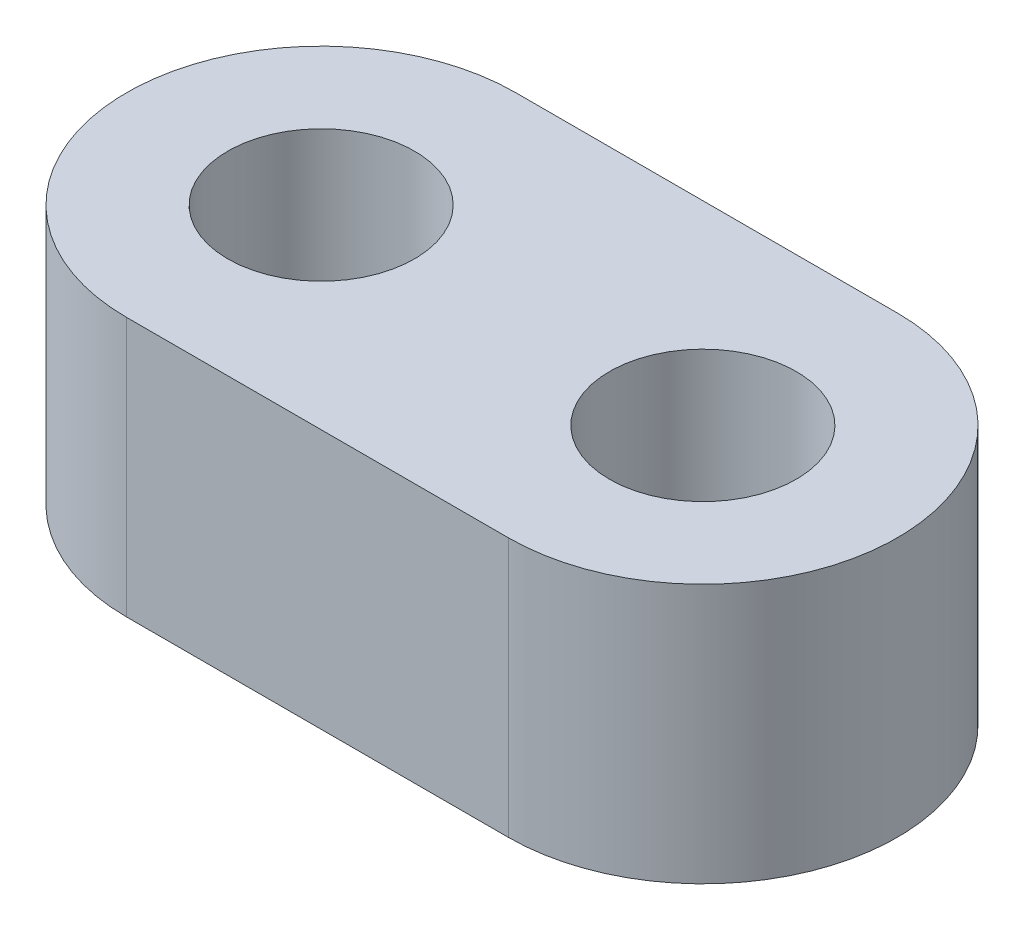
ISO-10303-21;
HEADER;
FILE_DESCRIPTION(('STEP AP214'),'2;1');
FILE_NAME('part.step','',(''),(''),'','','');
FILE_SCHEMA(('AUTOMOTIVE_DESIGN { 1 0 10303 214 1 1 1 1 }'));
ENDSEC;
DATA;
#1=APPLICATION_CONTEXT('core data for automotive mechanical design processes');
#2=APPLICATION_PROTOCOL_DEFINITION('international standard','automotive_design',2000,#1);
#3=PRODUCT_CONTEXT('',#1,'mechanical');
#4=PRODUCT('Part','Part','',(#3));
#5=PRODUCT_RELATED_PRODUCT_CATEGORY('part','',(#4));
#6=PRODUCT_DEFINITION_FORMATION('','',#4);
#7=PRODUCT_DEFINITION_CONTEXT('part definition',#1,'design');
#8=PRODUCT_DEFINITION('design','',#6,#7);
#9=PRODUCT_DEFINITION_SHAPE('','',#8);
#10=(LENGTH_UNIT() NAMED_UNIT(*) SI_UNIT(.MILLI.,.METRE.));
#11=(NAMED_UNIT(*) PLANE_ANGLE_UNIT() SI_UNIT($,.RADIAN.));
#12=(NAMED_UNIT(*) SI_UNIT($,.STERADIAN.) SOLID_ANGLE_UNIT());
#13=UNCERTAINTY_MEASURE_WITH_UNIT(LENGTH_MEASURE(1.E-05),#10,'distance_accuracy_value','');
#14=(GEOMETRIC_REPRESENTATION_CONTEXT(3) GLOBAL_UNCERTAINTY_ASSIGNED_CONTEXT((#13)) GLOBAL_UNIT_ASSIGNED_CONTEXT((#10,
#11,#12)) REPRESENTATION_CONTEXT('',''));
#15=CARTESIAN_POINT('',(0.,0.,0.));
#16=DIRECTION('',(0.,0.,1.));
#17=DIRECTION('',(1.,0.,0.));
#18=AXIS2_PLACEMENT_3D('',#15,#16,#17);
#19=CARTESIAN_POINT('',(0.,6.35,0.));
#20=DIRECTION('',(0.,1.,0.));
#21=DIRECTION('',(0.,0.,1.));
#22=AXIS2_PLACEMENT_3D('',#19,#20,#21);
#23=PLANE('',#22);
#24=CARTESIAN_POINT('',(9.34260638297873,6.35,0.));
#25=DIRECTION('',(0.,1.,0.));
#26=DIRECTION('',(0.,0.,1.));
#27=AXIS2_PLACEMENT_3D('',#24,#25,#26);
#28=CIRCLE('',#27,2.286);
#29=CARTESIAN_POINT('',(9.34260638297873,6.35,2.286));
#30=VERTEX_POINT('',#29);
#31=EDGE_CURVE('E174',#30,#30,#28,.T.);
#32=ORIENTED_EDGE('',*,*,#31,.F.);
#33=EDGE_LOOP('',(#32));
#34=FACE_BOUND('',#33,.T.);
#35=CARTESIAN_POINT('',(0.,6.35,0.));
#36=DIRECTION('',(0.,1.,0.));
#37=DIRECTION('',(0.,0.,1.));
#38=AXIS2_PLACEMENT_3D('',#35,#36,#37);
#39=CIRCLE('',#38,2.286);
#40=CARTESIAN_POINT('',(0.,6.35,2.286));
#41=VERTEX_POINT('',#40);
#42=EDGE_CURVE('E141',#41,#41,#39,.T.);
#43=ORIENTED_EDGE('',*,*,#42,.F.);
#44=EDGE_LOOP('',(#43));
#45=FACE_BOUND('',#44,.T.);
#46=DIRECTION('',(1.,0.,0.));
#47=VECTOR('',#46,1.);
#48=CARTESIAN_POINT('',(14.1051063829787,6.35,4.7625));
#49=LINE('',#48,#47);
#50=CARTESIAN_POINT('',(0.,6.35,4.7625));
#51=VERTEX_POINT('',#50);
#52=CARTESIAN_POINT('',(9.34260638297873,6.35,4.7625));
#53=VERTEX_POINT('',#52);
#54=EDGE_CURVE('E152',#51,#53,#49,.T.);
#55=ORIENTED_EDGE('',*,*,#54,.T.);
#56=CARTESIAN_POINT('',(9.34260638297873,6.35,0.));
#57=DIRECTION('',(0.,1.,0.));
#58=DIRECTION('',(0.,0.,1.));
#59=AXIS2_PLACEMENT_3D('',#56,#57,#58);
#60=CIRCLE('',#59,4.7625);
#61=CARTESIAN_POINT('',(9.34260638297873,6.35,-4.7625));
#62=VERTEX_POINT('',#61);
#63=EDGE_CURVE('E86',#62,#53,#60,.F.);
#64=ORIENTED_EDGE('',*,*,#63,.F.);
#65=DIRECTION('',(-1.,0.,0.));
#66=VECTOR('',#65,1.);
#67=CARTESIAN_POINT('',(0.,6.35,-4.7625));
#68=LINE('',#67,#66);
#69=CARTESIAN_POINT('',(0.,6.35,-4.7625));
#70=VERTEX_POINT('',#69);
#71=EDGE_CURVE('E146',#62,#70,#68,.T.);
#72=ORIENTED_EDGE('',*,*,#71,.T.);
#73=CARTESIAN_POINT('',(0.,6.35,0.));
#74=DIRECTION('',(0.,1.,0.));
#75=DIRECTION('',(0.,0.,1.));
#76=AXIS2_PLACEMENT_3D('',#73,#74,#75);
#77=CIRCLE('',#76,4.7625);
#78=EDGE_CURVE('E138',#70,#51,#77,.T.);
#79=ORIENTED_EDGE('',*,*,#78,.T.);
#80=EDGE_LOOP('',(#55,#64,#72,#79));
#81=FACE_BOUND('',#80,.T.);
#82=ADVANCED_FACE('F66',(#34,#45,#81),#23,.T.);
#83=CARTESIAN_POINT('',(0.,0.,0.));
#84=DIRECTION('',(0.,1.,0.));
#85=DIRECTION('',(0.,0.,1.));
#86=AXIS2_PLACEMENT_3D('',#83,#84,#85);
#87=PLANE('',#86);
#88=CARTESIAN_POINT('',(0.,0.,0.));
#89=DIRECTION('',(0.,1.,0.));
#90=DIRECTION('',(0.,0.,1.));
#91=AXIS2_PLACEMENT_3D('',#88,#89,#90);
#92=CIRCLE('',#91,2.286);
#93=CARTESIAN_POINT('',(0.,0.,2.286));
#94=VERTEX_POINT('',#93);
#95=EDGE_CURVE('E165',#94,#94,#92,.T.);
#96=ORIENTED_EDGE('',*,*,#95,.T.);
#97=EDGE_LOOP('',(#96));
#98=FACE_BOUND('',#97,.T.);
#99=CARTESIAN_POINT('',(9.34260638297873,0.,0.));
#100=DIRECTION('',(0.,1.,0.));
#101=DIRECTION('',(0.,0.,1.));
#102=AXIS2_PLACEMENT_3D('',#99,#100,#101);
#103=CIRCLE('',#102,2.286);
#104=CARTESIAN_POINT('',(9.34260638297873,0.,2.286));
#105=VERTEX_POINT('',#104);
#106=EDGE_CURVE('E128',#105,#105,#103,.T.);
#107=ORIENTED_EDGE('',*,*,#106,.T.);
#108=EDGE_LOOP('',(#107));
#109=FACE_BOUND('',#108,.T.);
#110=CARTESIAN_POINT('',(9.34260638297873,0.,0.));
#111=DIRECTION('',(0.,1.,0.));
#112=DIRECTION('',(0.,0.,1.));
#113=AXIS2_PLACEMENT_3D('',#110,#111,#112);
#114=CIRCLE('',#113,4.7625);
#115=CARTESIAN_POINT('',(9.34260638297873,0.,-4.7625));
#116=VERTEX_POINT('',#115);
#117=CARTESIAN_POINT('',(9.34260638297873,0.,4.7625));
#118=VERTEX_POINT('',#117);
#119=EDGE_CURVE('E92',#116,#118,#114,.F.);
#120=ORIENTED_EDGE('',*,*,#119,.T.);
#121=DIRECTION('',(1.,0.,0.));
#122=VECTOR('',#121,1.);
#123=CARTESIAN_POINT('',(14.1051063829787,0.,4.7625));
#124=LINE('',#123,#122);
#125=CARTESIAN_POINT('',(0.,0.,4.7625));
#126=VERTEX_POINT('',#125);
#127=EDGE_CURVE('E118',#126,#118,#124,.T.);
#128=ORIENTED_EDGE('',*,*,#127,.F.);
#129=CARTESIAN_POINT('',(0.,0.,0.));
#130=DIRECTION('',(0.,1.,0.));
#131=DIRECTION('',(0.,0.,1.));
#132=AXIS2_PLACEMENT_3D('',#129,#130,#131);
#133=CIRCLE('',#132,4.7625);
#134=CARTESIAN_POINT('',(0.,0.,-4.7625));
#135=VERTEX_POINT('',#134);
#136=EDGE_CURVE('E137',#135,#126,#133,.T.);
#137=ORIENTED_EDGE('',*,*,#136,.F.);
#138=DIRECTION('',(-1.,0.,0.));
#139=VECTOR('',#138,1.);
#140=CARTESIAN_POINT('',(0.,0.,-4.7625));
#141=LINE('',#140,#139);
#142=EDGE_CURVE('E122',#116,#135,#141,.T.);
#143=ORIENTED_EDGE('',*,*,#142,.F.);
#144=EDGE_LOOP('',(#120,#128,#137,#143));
#145=FACE_BOUND('',#144,.T.);
#146=ADVANCED_FACE('F120',(#98,#109,#145),#87,.F.);
#147=CARTESIAN_POINT('',(0.,6.35,-4.7625));
#148=DIRECTION('',(0.,0.,1.));
#149=DIRECTION('',(1.,0.,0.));
#150=AXIS2_PLACEMENT_3D('',#147,#148,#149);
#151=PLANE('',#150);
#152=DIRECTION('',(0.,1.,0.));
#153=VECTOR('',#152,1.);
#154=CARTESIAN_POINT('',(9.34260638297873,0.,-4.7625));
#155=LINE('',#154,#153);
#156=EDGE_CURVE('E124',#116,#62,#155,.T.);
#157=ORIENTED_EDGE('',*,*,#156,.F.);
#158=ORIENTED_EDGE('',*,*,#142,.T.);
#159=DIRECTION('',(0.,-1.,0.));
#160=VECTOR('',#159,1.);
#161=CARTESIAN_POINT('',(0.,6.35,-4.7625));
#162=LINE('',#161,#160);
#163=EDGE_CURVE('E79',#70,#135,#162,.T.);
#164=ORIENTED_EDGE('',*,*,#163,.F.);
#165=ORIENTED_EDGE('',*,*,#71,.F.);
#166=EDGE_LOOP('',(#157,#158,#164,#165));
#167=FACE_BOUND('',#166,.T.);
#168=ADVANCED_FACE('F195',(#167),#151,.F.);
#169=CARTESIAN_POINT('',(0.,6.35,0.));
#170=DIRECTION('',(0.,-1.,0.));
#171=DIRECTION('',(0.,0.,-1.));
#172=AXIS2_PLACEMENT_3D('',#169,#170,#171);
#173=CYLINDRICAL_SURFACE('',#172,4.7625);
#174=ORIENTED_EDGE('',*,*,#136,.T.);
#175=DIRECTION('',(0.,-1.,0.));
#176=VECTOR('',#175,1.);
#177=CARTESIAN_POINT('',(0.,6.35,4.7625));
#178=LINE('',#177,#176);
#179=EDGE_CURVE('E12',#51,#126,#178,.T.);
#180=ORIENTED_EDGE('',*,*,#179,.F.);
#181=ORIENTED_EDGE('',*,*,#78,.F.);
#182=ORIENTED_EDGE('',*,*,#163,.T.);
#183=EDGE_LOOP('',(#174,#180,#181,#182));
#184=FACE_BOUND('',#183,.T.);
#185=ADVANCED_FACE('F72',(#184),#173,.T.);
#186=CARTESIAN_POINT('',(14.1051063829787,6.35,4.7625));
#187=DIRECTION('',(0.,0.,-1.));
#188=DIRECTION('',(-1.,0.,0.));
#189=AXIS2_PLACEMENT_3D('',#186,#187,#188);
#190=PLANE('',#189);
#191=ORIENTED_EDGE('',*,*,#127,.T.);
#192=DIRECTION('',(0.,1.,0.));
#193=VECTOR('',#192,1.);
#194=CARTESIAN_POINT('',(9.34260638297873,0.,4.7625));
#195=LINE('',#194,#193);
#196=EDGE_CURVE('E123',#118,#53,#195,.T.);
#197=ORIENTED_EDGE('',*,*,#196,.T.);
#198=ORIENTED_EDGE('',*,*,#54,.F.);
#199=ORIENTED_EDGE('',*,*,#179,.T.);
#200=EDGE_LOOP('',(#191,#197,#198,#199));
#201=FACE_BOUND('',#200,.T.);
#202=ADVANCED_FACE('F135',(#201),#190,.F.);
#203=CARTESIAN_POINT('',(0.,6.35,0.));
#204=DIRECTION('',(0.,-1.,0.));
#205=DIRECTION('',(0.,0.,-1.));
#206=AXIS2_PLACEMENT_3D('',#203,#204,#205);
#207=CYLINDRICAL_SURFACE('',#206,2.286);
#208=ORIENTED_EDGE('',*,*,#42,.T.);
#209=EDGE_LOOP('',(#208));
#210=FACE_BOUND('',#209,.T.);
#211=ORIENTED_EDGE('',*,*,#95,.F.);
#212=EDGE_LOOP('',(#211));
#213=FACE_BOUND('',#212,.T.);
#214=ADVANCED_FACE('F197',(#210,#213),#207,.F.);
#215=CARTESIAN_POINT('',(9.34260638297873,0.,0.));
#216=DIRECTION('',(0.,1.,0.));
#217=DIRECTION('',(0.,0.,1.));
#218=AXIS2_PLACEMENT_3D('',#215,#216,#217);
#219=CYLINDRICAL_SURFACE('',#218,4.7625);
#220=ORIENTED_EDGE('',*,*,#63,.T.);
#221=ORIENTED_EDGE('',*,*,#196,.F.);
#222=ORIENTED_EDGE('',*,*,#119,.F.);
#223=ORIENTED_EDGE('',*,*,#156,.T.);
#224=EDGE_LOOP('',(#220,#221,#222,#223));
#225=FACE_BOUND('',#224,.T.);
#226=ADVANCED_FACE('F127',(#225),#219,.T.);
#227=CARTESIAN_POINT('',(9.34260638297873,0.,0.));
#228=DIRECTION('',(0.,1.,0.));
#229=DIRECTION('',(0.,0.,1.));
#230=AXIS2_PLACEMENT_3D('',#227,#228,#229);
#231=CYLINDRICAL_SURFACE('',#230,2.286);
#232=ORIENTED_EDGE('',*,*,#106,.F.);
#233=EDGE_LOOP('',(#232));
#234=FACE_BOUND('',#233,.T.);
#235=ORIENTED_EDGE('',*,*,#31,.T.);
#236=EDGE_LOOP('',(#235));
#237=FACE_BOUND('',#236,.T.);
#238=ADVANCED_FACE('F182',(#234,#237),#231,.F.);
#239=CLOSED_SHELL('',(#82,#146,#168,#185,#202,#214,#226,#238));
#240=MANIFOLD_SOLID_BREP('B2',#239);
#241=ADVANCED_BREP_SHAPE_REPRESENTATION('',(#18,#240),#14);
#242=SHAPE_DEFINITION_REPRESENTATION(#9,#241);
ENDSEC;
END-ISO-10303-21;
